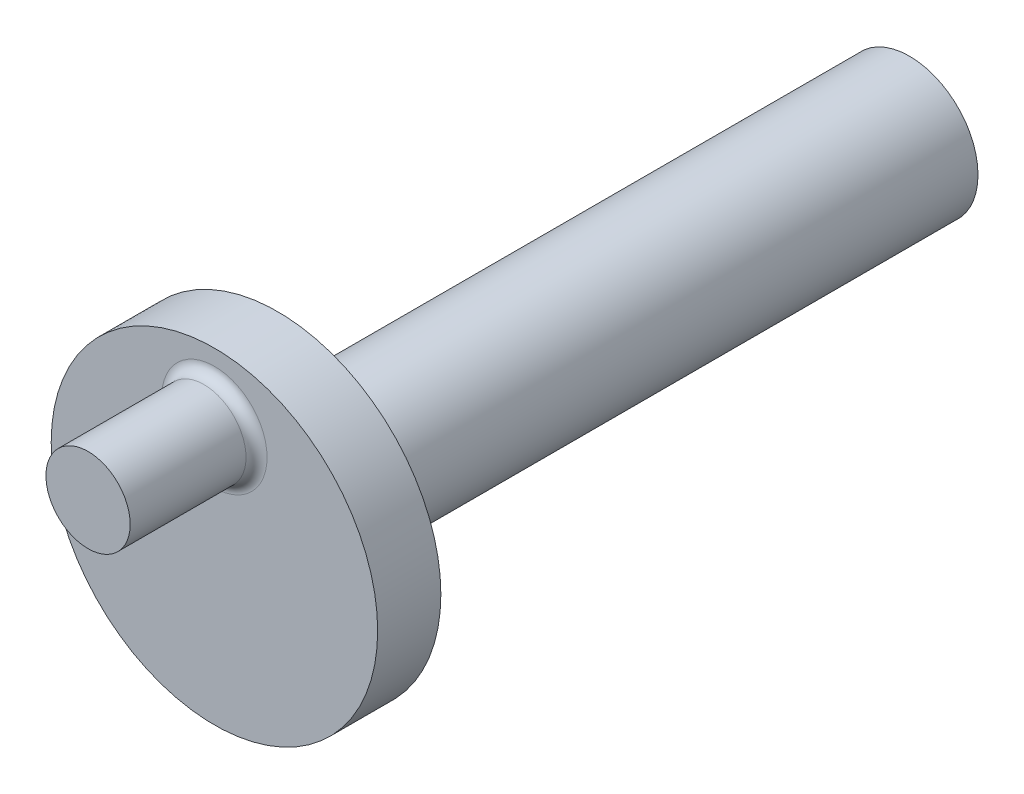
ISO-10303-21;
HEADER;
FILE_DESCRIPTION(('STEP AP214'),'2;1');
FILE_NAME('part.step','',(''),(''),'','','');
FILE_SCHEMA(('AUTOMOTIVE_DESIGN { 1 0 10303 214 1 1 1 1 }'));
ENDSEC;
DATA;
#1=APPLICATION_CONTEXT('core data for automotive mechanical design processes');
#2=APPLICATION_PROTOCOL_DEFINITION('international standard','automotive_design',2000,#1);
#3=PRODUCT_CONTEXT('',#1,'mechanical');
#4=PRODUCT('Part','Part','',(#3));
#5=PRODUCT_RELATED_PRODUCT_CATEGORY('part','',(#4));
#6=PRODUCT_DEFINITION_FORMATION('','',#4);
#7=PRODUCT_DEFINITION_CONTEXT('part definition',#1,'design');
#8=PRODUCT_DEFINITION('design','',#6,#7);
#9=PRODUCT_DEFINITION_SHAPE('','',#8);
#10=(LENGTH_UNIT() NAMED_UNIT(*) SI_UNIT(.MILLI.,.METRE.));
#11=(NAMED_UNIT(*) PLANE_ANGLE_UNIT() SI_UNIT($,.RADIAN.));
#12=(NAMED_UNIT(*) SI_UNIT($,.STERADIAN.) SOLID_ANGLE_UNIT());
#13=UNCERTAINTY_MEASURE_WITH_UNIT(LENGTH_MEASURE(1.E-05),#10,'distance_accuracy_value','');
#14=(GEOMETRIC_REPRESENTATION_CONTEXT(3) GLOBAL_UNCERTAINTY_ASSIGNED_CONTEXT((#13)) GLOBAL_UNIT_ASSIGNED_CONTEXT((#10,
#11,#12)) REPRESENTATION_CONTEXT('',''));
#15=CARTESIAN_POINT('',(0.,0.,0.));
#16=DIRECTION('',(0.,0.,1.));
#17=DIRECTION('',(1.,0.,0.));
#18=AXIS2_PLACEMENT_3D('',#15,#16,#17);
#19=CARTESIAN_POINT('',(0.,0.,3.));
#20=DIRECTION('',(0.,0.,-1.));
#21=DIRECTION('',(-1.,0.,0.));
#22=AXIS2_PLACEMENT_3D('',#19,#20,#21);
#23=CYLINDRICAL_SURFACE('',#22,15.5);
#24=CARTESIAN_POINT('',(0.,0.,3.));
#25=DIRECTION('',(0.,0.,1.));
#26=DIRECTION('',(1.,0.,0.));
#27=AXIS2_PLACEMENT_3D('',#24,#25,#26);
#28=CIRCLE('',#27,15.5);
#29=CARTESIAN_POINT('',(15.5,0.,3.));
#30=VERTEX_POINT('',#29);
#31=EDGE_CURVE('E54',#30,#30,#28,.T.);
#32=ORIENTED_EDGE('',*,*,#31,.F.);
#33=EDGE_LOOP('',(#32));
#34=FACE_BOUND('',#33,.T.);
#35=CARTESIAN_POINT('',(0.,0.,-3.));
#36=DIRECTION('',(0.,0.,1.));
#37=DIRECTION('',(1.,0.,0.));
#38=AXIS2_PLACEMENT_3D('',#35,#36,#37);
#39=CIRCLE('',#38,15.5);
#40=CARTESIAN_POINT('',(15.5,0.,-3.));
#41=VERTEX_POINT('',#40);
#42=EDGE_CURVE('E55',#41,#41,#39,.T.);
#43=ORIENTED_EDGE('',*,*,#42,.T.);
#44=EDGE_LOOP('',(#43));
#45=FACE_BOUND('',#44,.T.);
#46=ADVANCED_FACE('F34',(#34,#45),#23,.T.);
#47=CARTESIAN_POINT('',(0.,0.,3.));
#48=DIRECTION('',(0.,0.,1.));
#49=DIRECTION('',(1.,0.,0.));
#50=AXIS2_PLACEMENT_3D('',#47,#48,#49);
#51=PLANE('',#50);
#52=CARTESIAN_POINT('',(0.,8.99999999999999,3.));
#53=DIRECTION('',(0.,0.,1.));
#54=DIRECTION('',(1.,0.,0.));
#55=AXIS2_PLACEMENT_3D('',#52,#53,#54);
#56=CIRCLE('',#55,5.);
#57=CARTESIAN_POINT('',(5.,8.99999999999999,3.));
#58=VERTEX_POINT('',#57);
#59=EDGE_CURVE('E10',#58,#58,#56,.F.);
#60=ORIENTED_EDGE('',*,*,#59,.T.);
#61=EDGE_LOOP('',(#60));
#62=FACE_BOUND('',#61,.T.);
#63=ORIENTED_EDGE('',*,*,#31,.T.);
#64=EDGE_LOOP('',(#63));
#65=FACE_BOUND('',#64,.T.);
#66=ADVANCED_FACE('F84',(#62,#65),#51,.T.);
#67=CARTESIAN_POINT('',(0.,0.,-3.));
#68=DIRECTION('',(0.,0.,1.));
#69=DIRECTION('',(1.,0.,0.));
#70=AXIS2_PLACEMENT_3D('',#67,#68,#69);
#71=PLANE('',#70);
#72=CARTESIAN_POINT('',(0.,0.,-3.));
#73=DIRECTION('',(0.,0.,1.));
#74=DIRECTION('',(1.,0.,0.));
#75=AXIS2_PLACEMENT_3D('',#72,#73,#74);
#76=CIRCLE('',#75,7.5);
#77=CARTESIAN_POINT('',(7.5,0.,-3.));
#78=VERTEX_POINT('',#77);
#79=EDGE_CURVE('E45',#78,#78,#76,.T.);
#80=ORIENTED_EDGE('',*,*,#79,.T.);
#81=EDGE_LOOP('',(#80));
#82=FACE_BOUND('',#81,.T.);
#83=ORIENTED_EDGE('',*,*,#42,.F.);
#84=EDGE_LOOP('',(#83));
#85=FACE_BOUND('',#84,.T.);
#86=ADVANCED_FACE('F90',(#82,#85),#71,.F.);
#87=CARTESIAN_POINT('',(0.,8.99999999999999,15.));
#88=DIRECTION('',(0.,0.,-1.));
#89=DIRECTION('',(-1.,0.,0.));
#90=AXIS2_PLACEMENT_3D('',#87,#88,#89);
#91=CYLINDRICAL_SURFACE('',#90,4.);
#92=CARTESIAN_POINT('',(0.,8.99999999999999,4.));
#93=DIRECTION('',(0.,0.,1.));
#94=DIRECTION('',(1.,0.,0.));
#95=AXIS2_PLACEMENT_3D('',#92,#93,#94);
#96=CIRCLE('',#95,4.);
#97=CARTESIAN_POINT('',(4.,8.99999999999999,4.));
#98=VERTEX_POINT('',#97);
#99=EDGE_CURVE('E41',#98,#98,#96,.T.);
#100=ORIENTED_EDGE('',*,*,#99,.T.);
#101=EDGE_LOOP('',(#100));
#102=FACE_BOUND('',#101,.T.);
#103=CARTESIAN_POINT('',(0.,8.99999999999999,15.));
#104=DIRECTION('',(0.,0.,1.));
#105=DIRECTION('',(1.,0.,0.));
#106=AXIS2_PLACEMENT_3D('',#103,#104,#105);
#107=CIRCLE('',#106,4.);
#108=CARTESIAN_POINT('',(4.,8.99999999999999,15.));
#109=VERTEX_POINT('',#108);
#110=EDGE_CURVE('E58',#109,#109,#107,.T.);
#111=ORIENTED_EDGE('',*,*,#110,.F.);
#112=EDGE_LOOP('',(#111));
#113=FACE_BOUND('',#112,.T.);
#114=ADVANCED_FACE('F80',(#102,#113),#91,.T.);
#115=CARTESIAN_POINT('',(0.,8.99999999999999,15.));
#116=DIRECTION('',(0.,0.,1.));
#117=DIRECTION('',(1.,0.,0.));
#118=AXIS2_PLACEMENT_3D('',#115,#116,#117);
#119=PLANE('',#118);
#120=ORIENTED_EDGE('',*,*,#110,.T.);
#121=EDGE_LOOP('',(#120));
#122=FACE_BOUND('',#121,.T.);
#123=ADVANCED_FACE('F71',(#122),#119,.T.);
#124=CARTESIAN_POINT('',(0.,0.,-63.));
#125=DIRECTION('',(0.,0.,1.));
#126=DIRECTION('',(1.,0.,0.));
#127=AXIS2_PLACEMENT_3D('',#124,#125,#126);
#128=CYLINDRICAL_SURFACE('',#127,6.5);
#129=CARTESIAN_POINT('',(0.,0.,-4.));
#130=DIRECTION('',(0.,0.,1.));
#131=DIRECTION('',(1.,0.,0.));
#132=AXIS2_PLACEMENT_3D('',#129,#130,#131);
#133=CIRCLE('',#132,6.5);
#134=CARTESIAN_POINT('',(6.5,0.,-4.));
#135=VERTEX_POINT('',#134);
#136=EDGE_CURVE('E49',#135,#135,#133,.F.);
#137=ORIENTED_EDGE('',*,*,#136,.T.);
#138=EDGE_LOOP('',(#137));
#139=FACE_BOUND('',#138,.T.);
#140=CARTESIAN_POINT('',(0.,0.,-63.));
#141=DIRECTION('',(0.,0.,-1.));
#142=DIRECTION('',(-1.,0.,0.));
#143=AXIS2_PLACEMENT_3D('',#140,#141,#142);
#144=CIRCLE('',#143,6.5);
#145=CARTESIAN_POINT('',(-6.5,0.,-63.));
#146=VERTEX_POINT('',#145);
#147=EDGE_CURVE('E63',#146,#146,#144,.T.);
#148=ORIENTED_EDGE('',*,*,#147,.F.);
#149=EDGE_LOOP('',(#148));
#150=FACE_BOUND('',#149,.T.);
#151=ADVANCED_FACE('F69',(#139,#150),#128,.T.);
#152=CARTESIAN_POINT('',(0.,0.,-63.));
#153=DIRECTION('',(0.,0.,-1.));
#154=DIRECTION('',(-1.,0.,0.));
#155=AXIS2_PLACEMENT_3D('',#152,#153,#154);
#156=PLANE('',#155);
#157=ORIENTED_EDGE('',*,*,#147,.T.);
#158=EDGE_LOOP('',(#157));
#159=FACE_BOUND('',#158,.T.);
#160=ADVANCED_FACE('F67',(#159),#156,.T.);
#161=CARTESIAN_POINT('',(0.,0.,-4.));
#162=DIRECTION('',(0.,0.,1.));
#163=DIRECTION('',(1.,0.,0.));
#164=AXIS2_PLACEMENT_3D('',#161,#162,#163);
#165=TOROIDAL_SURFACE('',#164,7.5,1.);
#166=ORIENTED_EDGE('',*,*,#79,.F.);
#167=EDGE_LOOP('',(#166));
#168=FACE_BOUND('',#167,.T.);
#169=ORIENTED_EDGE('',*,*,#136,.F.);
#170=EDGE_LOOP('',(#169));
#171=FACE_BOUND('',#170,.T.);
#172=ADVANCED_FACE('F78',(#168,#171),#165,.F.);
#173=CARTESIAN_POINT('',(0.,8.99999999999999,4.));
#174=DIRECTION('',(0.,0.,1.));
#175=DIRECTION('',(1.,0.,0.));
#176=AXIS2_PLACEMENT_3D('',#173,#174,#175);
#177=TOROIDAL_SURFACE('',#176,5.,1.);
#178=ORIENTED_EDGE('',*,*,#59,.F.);
#179=EDGE_LOOP('',(#178));
#180=FACE_BOUND('',#179,.T.);
#181=ORIENTED_EDGE('',*,*,#99,.F.);
#182=EDGE_LOOP('',(#181));
#183=FACE_BOUND('',#182,.T.);
#184=ADVANCED_FACE('F36',(#180,#183),#177,.F.);
#185=CLOSED_SHELL('',(#46,#66,#86,#114,#123,#151,#160,#172,#184));
#186=MANIFOLD_SOLID_BREP('B2',#185);
#187=ADVANCED_BREP_SHAPE_REPRESENTATION('',(#18,#186),#14);
#188=SHAPE_DEFINITION_REPRESENTATION(#9,#187);
ENDSEC;
END-ISO-10303-21;
